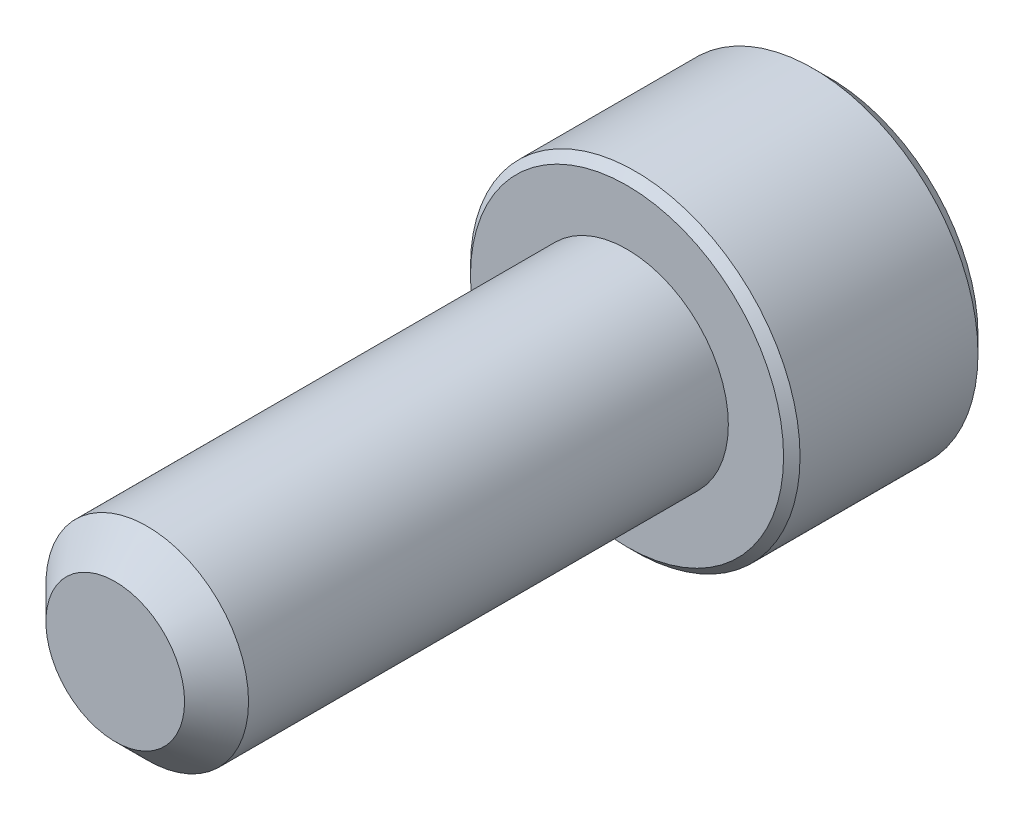
ISO-10303-21;
HEADER;
FILE_DESCRIPTION(('STEP AP214'),'2;1');
FILE_NAME('part.step','',(''),(''),'','','');
FILE_SCHEMA(('AUTOMOTIVE_DESIGN { 1 0 10303 214 1 1 1 1 }'));
ENDSEC;
DATA;
#1=APPLICATION_CONTEXT('core data for automotive mechanical design processes');
#2=APPLICATION_PROTOCOL_DEFINITION('international standard','automotive_design',2000,#1);
#3=PRODUCT_CONTEXT('',#1,'mechanical');
#4=PRODUCT('Part','Part','',(#3));
#5=PRODUCT_RELATED_PRODUCT_CATEGORY('part','',(#4));
#6=PRODUCT_DEFINITION_FORMATION('','',#4);
#7=PRODUCT_DEFINITION_CONTEXT('part definition',#1,'design');
#8=PRODUCT_DEFINITION('design','',#6,#7);
#9=PRODUCT_DEFINITION_SHAPE('','',#8);
#10=(LENGTH_UNIT() NAMED_UNIT(*) SI_UNIT(.MILLI.,.METRE.));
#11=(NAMED_UNIT(*) PLANE_ANGLE_UNIT() SI_UNIT($,.RADIAN.));
#12=(NAMED_UNIT(*) SI_UNIT($,.STERADIAN.) SOLID_ANGLE_UNIT());
#13=UNCERTAINTY_MEASURE_WITH_UNIT(LENGTH_MEASURE(1.E-05),#10,'distance_accuracy_value','');
#14=(GEOMETRIC_REPRESENTATION_CONTEXT(3) GLOBAL_UNCERTAINTY_ASSIGNED_CONTEXT((#13)) GLOBAL_UNIT_ASSIGNED_CONTEXT((#10,
#11,#12)) REPRESENTATION_CONTEXT('',''));
#15=CARTESIAN_POINT('',(0.,0.,0.));
#16=DIRECTION('',(0.,0.,1.));
#17=DIRECTION('',(1.,0.,0.));
#18=AXIS2_PLACEMENT_3D('',#15,#16,#17);
#19=CARTESIAN_POINT('',(0.,0.,-6.35));
#20=DIRECTION('',(0.,0.,1.));
#21=DIRECTION('',(1.,0.,0.));
#22=AXIS2_PLACEMENT_3D('',#19,#20,#21);
#23=CYLINDRICAL_SURFACE('',#22,1.2573);
#24=CARTESIAN_POINT('',(0.,0.,-0.396875));
#25=DIRECTION('',(0.,0.,1.));
#26=DIRECTION('',(1.,0.,0.));
#27=AXIS2_PLACEMENT_3D('',#24,#25,#26);
#28=CIRCLE('',#27,1.2573);
#29=CARTESIAN_POINT('',(1.2573,0.,-0.396875));
#30=VERTEX_POINT('',#29);
#31=EDGE_CURVE('E111',#30,#30,#28,.F.);
#32=ORIENTED_EDGE('',*,*,#31,.T.);
#33=EDGE_LOOP('',(#32));
#34=FACE_BOUND('',#33,.T.);
#35=CARTESIAN_POINT('',(0.,0.,-6.35));
#36=DIRECTION('',(0.,0.,-1.));
#37=DIRECTION('',(-1.,0.,0.));
#38=AXIS2_PLACEMENT_3D('',#35,#36,#37);
#39=CIRCLE('',#38,1.2573);
#40=CARTESIAN_POINT('',(-1.2573,0.,-6.35));
#41=VERTEX_POINT('',#40);
#42=EDGE_CURVE('E214',#41,#41,#39,.F.);
#43=ORIENTED_EDGE('',*,*,#42,.T.);
#44=EDGE_LOOP('',(#43));
#45=FACE_BOUND('',#44,.T.);
#46=ADVANCED_FACE('F37',(#34,#45),#23,.T.);
#47=CARTESIAN_POINT('',(0.,0.,0.));
#48=DIRECTION('',(0.,0.,1.));
#49=DIRECTION('',(1.,0.,0.));
#50=AXIS2_PLACEMENT_3D('',#47,#48,#49);
#51=PLANE('',#50);
#52=CARTESIAN_POINT('',(0.,0.,0.));
#53=DIRECTION('',(0.,0.,1.));
#54=DIRECTION('',(1.,0.,0.));
#55=AXIS2_PLACEMENT_3D('',#52,#53,#54);
#56=CIRCLE('',#55,0.860425000000002);
#57=CARTESIAN_POINT('',(0.860425000000002,0.,0.));
#58=VERTEX_POINT('',#57);
#59=EDGE_CURVE('E213',#58,#58,#56,.T.);
#60=ORIENTED_EDGE('',*,*,#59,.T.);
#61=EDGE_LOOP('',(#60));
#62=FACE_BOUND('',#61,.T.);
#63=ADVANCED_FACE('F191',(#62),#51,.T.);
#64=CARTESIAN_POINT('',(0.,0.,0.));
#65=DIRECTION('',(0.,0.,-1.));
#66=DIRECTION('',(-1.,0.,0.));
#67=AXIS2_PLACEMENT_3D('',#64,#65,#66);
#68=CONICAL_SURFACE('',#67,0.860425000000002,0.785398163397446);
#69=ORIENTED_EDGE('',*,*,#31,.F.);
#70=EDGE_LOOP('',(#69));
#71=FACE_BOUND('',#70,.T.);
#72=ORIENTED_EDGE('',*,*,#59,.F.);
#73=EDGE_LOOP('',(#72));
#74=FACE_BOUND('',#73,.T.);
#75=ADVANCED_FACE('F197',(#71,#74),#68,.T.);
#76=CARTESIAN_POINT('',(0.,0.,-8.8646));
#77=DIRECTION('',(0.,0.,1.));
#78=DIRECTION('',(1.,0.,0.));
#79=AXIS2_PLACEMENT_3D('',#76,#77,#78);
#80=CYLINDRICAL_SURFACE('',#79,2.0447);
#81=CARTESIAN_POINT('',(0.,0.,-6.452235));
#82=DIRECTION('',(0.,0.,-1.));
#83=DIRECTION('',(-1.,0.,0.));
#84=AXIS2_PLACEMENT_3D('',#81,#82,#83);
#85=CIRCLE('',#84,2.0447);
#86=CARTESIAN_POINT('',(-2.0447,0.,-6.452235));
#87=VERTEX_POINT('',#86);
#88=EDGE_CURVE('E45',#87,#87,#85,.T.);
#89=ORIENTED_EDGE('',*,*,#88,.T.);
#90=EDGE_LOOP('',(#89));
#91=FACE_BOUND('',#90,.T.);
#92=CARTESIAN_POINT('',(0.,0.,-8.66013));
#93=DIRECTION('',(0.,0.,-1.));
#94=DIRECTION('',(-1.,0.,0.));
#95=AXIS2_PLACEMENT_3D('',#92,#93,#94);
#96=CIRCLE('',#95,2.0447);
#97=CARTESIAN_POINT('',(-2.0447,0.,-8.66013));
#98=VERTEX_POINT('',#97);
#99=EDGE_CURVE('E174',#98,#98,#96,.F.);
#100=ORIENTED_EDGE('',*,*,#99,.T.);
#101=EDGE_LOOP('',(#100));
#102=FACE_BOUND('',#101,.T.);
#103=ADVANCED_FACE('F179',(#91,#102),#80,.T.);
#104=CARTESIAN_POINT('',(0.,0.,-8.8646));
#105=DIRECTION('',(0.,0.,-1.));
#106=DIRECTION('',(-1.,0.,0.));
#107=AXIS2_PLACEMENT_3D('',#104,#105,#106);
#108=PLANE('',#107);
#109=CARTESIAN_POINT('',(0.,0.,-8.8646));
#110=DIRECTION('',(0.,0.,-1.));
#111=DIRECTION('',(-1.,0.,0.));
#112=AXIS2_PLACEMENT_3D('',#109,#110,#111);
#113=CIRCLE('',#112,1.84023);
#114=CARTESIAN_POINT('',(-1.84023,0.,-8.8646));
#115=VERTEX_POINT('',#114);
#116=EDGE_CURVE('E110',#115,#115,#113,.T.);
#117=ORIENTED_EDGE('',*,*,#116,.T.);
#118=EDGE_LOOP('',(#117));
#119=FACE_BOUND('',#118,.T.);
#120=CARTESIAN_POINT('',(0.,0.,-8.8646));
#121=DIRECTION('',(0.,0.,-1.));
#122=DIRECTION('',(-1.,0.,0.));
#123=AXIS2_PLACEMENT_3D('',#120,#121,#122);
#124=CIRCLE('',#123,1.14567944042316);
#125=CARTESIAN_POINT('',(-0.9921875,0.572839720211583,-8.8646));
#126=VERTEX_POINT('',#125);
#127=CARTESIAN_POINT('',(0.,1.14567944042316,-8.8646));
#128=VERTEX_POINT('',#127);
#129=EDGE_CURVE('E91',#126,#128,#124,.T.);
#130=ORIENTED_EDGE('',*,*,#129,.F.);
#131=CARTESIAN_POINT('',(-0.9921875,-0.572839720211582,-8.8646));
#132=VERTEX_POINT('',#131);
#133=EDGE_CURVE('E51',#132,#126,#124,.T.);
#134=ORIENTED_EDGE('',*,*,#133,.F.);
#135=CARTESIAN_POINT('',(0.,-1.14567944042316,-8.8646));
#136=VERTEX_POINT('',#135);
#137=EDGE_CURVE('E273',#136,#132,#124,.T.);
#138=ORIENTED_EDGE('',*,*,#137,.F.);
#139=CARTESIAN_POINT('',(0.9921875,-0.572839720211582,-8.8646));
#140=VERTEX_POINT('',#139);
#141=EDGE_CURVE('E58',#140,#136,#124,.T.);
#142=ORIENTED_EDGE('',*,*,#141,.F.);
#143=CARTESIAN_POINT('',(0.9921875,0.572839720211582,-8.8646));
#144=VERTEX_POINT('',#143);
#145=EDGE_CURVE('E132',#144,#140,#124,.T.);
#146=ORIENTED_EDGE('',*,*,#145,.F.);
#147=EDGE_CURVE('E100',#128,#144,#124,.T.);
#148=ORIENTED_EDGE('',*,*,#147,.F.);
#149=EDGE_LOOP('',(#130,#134,#138,#142,#146,#148));
#150=FACE_BOUND('',#149,.T.);
#151=ADVANCED_FACE('F131',(#119,#150),#108,.T.);
#152=CARTESIAN_POINT('',(0.,0.,-6.35));
#153=DIRECTION('',(0.,0.,-1.));
#154=DIRECTION('',(-1.,0.,0.));
#155=AXIS2_PLACEMENT_3D('',#152,#153,#154);
#156=PLANE('',#155);
#157=CARTESIAN_POINT('',(0.,0.,-6.35));
#158=DIRECTION('',(0.,0.,-1.));
#159=DIRECTION('',(-1.,0.,0.));
#160=AXIS2_PLACEMENT_3D('',#157,#158,#159);
#161=CIRCLE('',#160,1.942465);
#162=CARTESIAN_POINT('',(-1.942465,0.,-6.35));
#163=VERTEX_POINT('',#162);
#164=EDGE_CURVE('E12',#163,#163,#161,.F.);
#165=ORIENTED_EDGE('',*,*,#164,.T.);
#166=EDGE_LOOP('',(#165));
#167=FACE_BOUND('',#166,.T.);
#168=ORIENTED_EDGE('',*,*,#42,.F.);
#169=EDGE_LOOP('',(#168));
#170=FACE_BOUND('',#169,.T.);
#171=ADVANCED_FACE('F285',(#167,#170),#156,.F.);
#172=CARTESIAN_POINT('',(0.,0.,-8.8646));
#173=DIRECTION('',(0.,0.,-1.));
#174=DIRECTION('',(-1.,0.,0.));
#175=AXIS2_PLACEMENT_3D('',#172,#173,#174);
#176=CONICAL_SURFACE('',#175,1.14567944042316,0.78539816339745);
#177=ORIENTED_EDGE('',*,*,#147,.T.);
#178=CARTESIAN_POINT('',(-0.000200000000000158,1.145794910477,-8.86471548750897));
#179=CARTESIAN_POINT('',(0.0339140752321556,1.12609913995856,-8.84503281140466));
#180=CARTESIAN_POINT('',(0.0685985894922791,1.10607402631377,-8.82650568451841));
#181=CARTESIAN_POINT('',(0.139324581199958,1.06524035596264,-8.79258232965041));
#182=CARTESIAN_POINT('',(0.175372791624241,1.04442791197037,-8.77720498723095));
#183=CARTESIAN_POINT('',(0.248062511737395,1.00246048249572,-8.75086314273428));
#184=CARTESIAN_POINT('',(0.2846854890132,0.981316196707012,-8.73983239651314));
#185=CARTESIAN_POINT('',(0.358737506246055,0.938562244623589,-8.72283620567294));
#186=CARTESIAN_POINT('',(0.396164282559342,0.916953885244213,-8.71685806757892));
#187=CARTESIAN_POINT('',(0.46066463860547,0.879714587318154,-8.71146634491429));
#188=CARTESIAN_POINT('',(0.487654299314528,0.864132099442443,-8.71066899638834));
#189=CARTESIAN_POINT('',(0.541581355945663,0.832997298779853,-8.71200819336142));
#190=CARTESIAN_POINT('',(0.568518739024238,0.817444993408173,-8.71414538613705));
#191=CARTESIAN_POINT('',(0.648946222958496,0.771010163908485,-8.72481757130602));
#192=CARTESIAN_POINT('',(0.702036069363281,0.740358726795446,-8.73761438072271));
#193=CARTESIAN_POINT('',(0.795214637965796,0.686562055130081,-8.76849746765013));
#194=CARTESIAN_POINT('',(0.835740306309515,0.663164549602745,-8.7849650089077));
#195=CARTESIAN_POINT('',(0.915204315708207,0.617285982385523,-8.82206038355681));
#196=CARTESIAN_POINT('',(0.954147338261523,0.594802217831308,-8.84267468064554));
#197=CARTESIAN_POINT('',(0.9923875,0.572724250157744,-8.86471548750897));
#198=B_SPLINE_CURVE_WITH_KNOTS('',3,(#178,#179,#180,#181,#182,#183,#184,#185,#186,#187,#188,
#189,#190,#191,#192,#193,#194,#195,#196,#197),.UNSPECIFIED.,.F.,.F.,(4,2,2,2,2,2,2,2,2,4),(0.,
0.13219718521019,0.265165186853262,0.396020097605669,0.526545281028573,0.619935205043264,
0.713345731536163,0.900220051846368,1.04884529769095,1.1969930355767),.UNSPECIFIED.);
#199=EDGE_CURVE('E105',#128,#144,#198,.T.);
#200=ORIENTED_EDGE('',*,*,#199,.F.);
#201=EDGE_LOOP('',(#177,#200));
#202=FACE_BOUND('',#201,.T.);
#203=ADVANCED_FACE('F106',(#202),#176,.F.);
#204=ORIENTED_EDGE('',*,*,#145,.T.);
#205=CARTESIAN_POINT('',(0.9921875,-1.14247621078911,-9.23209203940828));
#206=CARTESIAN_POINT('',(0.9921875,-1.11465764801141,-9.2110916392497));
#207=CARTESIAN_POINT('',(0.9921875,-1.08668408094051,-9.19029714770578));
#208=CARTESIAN_POINT('',(0.9921875,-1.03036405365904,-9.1492050376869));
#209=CARTESIAN_POINT('',(0.9921875,-1.00201750223733,-9.12890754435707));
#210=CARTESIAN_POINT('',(0.9921875,-0.915909012346496,-9.06859850749393));
#211=CARTESIAN_POINT('',(0.9921875,-0.857501195839067,-9.02949385217264));
#212=CARTESIAN_POINT('',(0.9921875,-0.735022281240404,-8.95272675276114));
#213=CARTESIAN_POINT('',(0.9921875,-0.670818221894542,-8.91527403099626));
#214=CARTESIAN_POINT('',(0.9921875,-0.539203244212802,-8.84676502046105));
#215=CARTESIAN_POINT('',(0.9921875,-0.471804118965061,-8.81568716825431));
#216=CARTESIAN_POINT('',(0.9921875,-0.370637445252798,-8.77766629623626));
#217=CARTESIAN_POINT('',(0.9921875,-0.338367677251604,-8.76675403233245));
#218=CARTESIAN_POINT('',(0.9921875,-0.273049086247197,-8.74752023009933));
#219=CARTESIAN_POINT('',(0.9921875,-0.240000209742887,-8.73919887024719));
#220=CARTESIAN_POINT('',(0.9921875,-0.173878395816095,-8.72571877368215));
#221=CARTESIAN_POINT('',(0.9921875,-0.140816774716471,-8.72050539396509));
#222=CARTESIAN_POINT('',(0.9921875,-0.0743291671992153,-8.71333971245706));
#223=CARTESIAN_POINT('',(0.9921875,-0.0409031259919585,-8.71138790803542));
#224=CARTESIAN_POINT('',(0.9921875,0.0247631141129243,-8.71089348590571));
#225=CARTESIAN_POINT('',(0.9921875,0.0570024445003659,-8.71223003142075));
#226=CARTESIAN_POINT('',(0.9921875,0.12119422050107,-8.71797104321384));
#227=CARTESIAN_POINT('',(0.9921875,0.153146730366262,-8.72237480409387));
#228=CARTESIAN_POINT('',(0.9921875,0.217090524657735,-8.73408451115969));
#229=CARTESIAN_POINT('',(0.9921875,0.249072542149664,-8.74144030243665));
#230=CARTESIAN_POINT('',(0.9921875,0.312337779758395,-8.7586630913854));
#231=CARTESIAN_POINT('',(0.9921875,0.343621058108105,-8.76852987893501));
#232=CARTESIAN_POINT('',(0.9921875,0.442112983138562,-8.80330611159688));
#233=CARTESIAN_POINT('',(0.9921875,0.507919771198879,-8.83217616415081));
#234=CARTESIAN_POINT('',(0.9921875,0.636441891183644,-8.89636520992333));
#235=CARTESIAN_POINT('',(0.9921875,0.699145053961293,-8.93170737220965));
#236=CARTESIAN_POINT('',(0.9921875,0.818979830095493,-9.00462137086766));
#237=CARTESIAN_POINT('',(0.9921875,0.876233471712467,-9.04199513504846));
#238=CARTESIAN_POINT('',(0.9921875,0.960585190784996,-9.09977111190454));
#239=CARTESIAN_POINT('',(0.9921875,0.988338378424187,-9.11923348767096));
#240=CARTESIAN_POINT('',(0.9921875,1.04346551341386,-9.15867298177173));
#241=CARTESIAN_POINT('',(0.9921875,1.07083956239906,-9.17864995788478));
#242=CARTESIAN_POINT('',(0.9921875,1.09805574523311,-9.19884030564271));
#243=B_SPLINE_CURVE_WITH_KNOTS('',3,(#205,#206,#207,#208,#209,#210,#211,#212,#213,#214,#215,
#216,#217,#218,#219,#220,#221,#222,#223,#224,#225,#226,#227,#228,#229,#230,#231,#232,#233,#234,
#235,#236,#237,#238,#239,#240,#241,#242),.UNSPECIFIED.,.F.,.F.,(4,2,2,2,2,2,2,2,2,2,2,2,2,2,2,2,
2,2,4),(0.,0.104563127371703,0.209152318679108,0.419927098975113,0.642732653870157,
0.864771652131277,0.966879847039378,1.06899507422301,1.16925752982867,1.26953527342201,
1.36618351686957,1.46280954049584,1.56114078094885,1.65946379566813,1.87441437168727,
2.09015003608822,2.29516517576016,2.39685303378669,2.49851308339968),.UNSPECIFIED.);
#244=EDGE_CURVE('E99',#144,#140,#243,.F.);
#245=ORIENTED_EDGE('',*,*,#244,.F.);
#246=EDGE_LOOP('',(#204,#245));
#247=FACE_BOUND('',#246,.T.);
#248=ADVANCED_FACE('F279',(#247),#176,.F.);
#249=ORIENTED_EDGE('',*,*,#141,.T.);
#250=CARTESIAN_POINT('',(0.9923875,-0.572724250157744,-8.86471548750897));
#251=CARTESIAN_POINT('',(0.958273424767844,-0.592420020676184,-8.84503281140466));
#252=CARTESIAN_POINT('',(0.923588910507721,-0.612445134320978,-8.82650568451841));
#253=CARTESIAN_POINT('',(0.852862918800041,-0.65327880467211,-8.79258232965041));
#254=CARTESIAN_POINT('',(0.816814708375758,-0.674091248664374,-8.77720498723095));
#255=CARTESIAN_POINT('',(0.744124988262605,-0.716058678139022,-8.75086314273428));
#256=CARTESIAN_POINT('',(0.707502010986799,-0.737202963927734,-8.73983239651314));
#257=CARTESIAN_POINT('',(0.633449993753944,-0.779956916011157,-8.72283620567294));
#258=CARTESIAN_POINT('',(0.596023217440658,-0.801565275390533,-8.71685806757892));
#259=CARTESIAN_POINT('',(0.53152286139453,-0.838804573316592,-8.71146634491429));
#260=CARTESIAN_POINT('',(0.504533200685471,-0.854387061192303,-8.71066899638834));
#261=CARTESIAN_POINT('',(0.450606144054336,-0.885521861854893,-8.71200819336142));
#262=CARTESIAN_POINT('',(0.423668760975761,-0.901074167226573,-8.71414538613705));
#263=CARTESIAN_POINT('',(0.343241277041503,-0.947508996726261,-8.72481757130602));
#264=CARTESIAN_POINT('',(0.290151430636718,-0.9781604338393,-8.73761438072271));
#265=CARTESIAN_POINT('',(0.196972862034203,-1.03195710550467,-8.76849746765013));
#266=CARTESIAN_POINT('',(0.156447193690484,-1.055354611032,-8.7849650089077));
#267=CARTESIAN_POINT('',(0.0769831842917936,-1.10123317824922,-8.82206038355681));
#268=CARTESIAN_POINT('',(0.0380401617384773,-1.12371694280344,-8.84267468064554));
#269=CARTESIAN_POINT('',(-0.000199999999999378,-1.145794910477,-8.86471548750897));
#270=B_SPLINE_CURVE_WITH_KNOTS('',3,(#250,#251,#252,#253,#254,#255,#256,#257,#258,#259,#260,
#261,#262,#263,#264,#265,#266,#267,#268,#269),.UNSPECIFIED.,.F.,.F.,(4,2,2,2,2,2,2,2,2,4),(0.,
0.132197185210189,0.265165186853262,0.396020097605669,0.526545281028573,0.619935205043264,
0.713345731536164,0.900220051846369,1.04884529769095,1.19699303557669),.UNSPECIFIED.);
#271=EDGE_CURVE('E142',#140,#136,#270,.T.);
#272=ORIENTED_EDGE('',*,*,#271,.F.);
#273=EDGE_LOOP('',(#249,#272));
#274=FACE_BOUND('',#273,.T.);
#275=ADVANCED_FACE('F276',(#274),#176,.F.);
#276=ORIENTED_EDGE('',*,*,#137,.T.);
#277=CARTESIAN_POINT('',(0.000199999999999847,-1.145794910477,-8.86471548750897));
#278=CARTESIAN_POINT('',(-0.0339140752321565,-1.12609913995856,-8.84503281140465));
#279=CARTESIAN_POINT('',(-0.0685985894922804,-1.10607402631377,-8.82650568451841));
#280=CARTESIAN_POINT('',(-0.13932458119996,-1.06524035596263,-8.7925823296504));
#281=CARTESIAN_POINT('',(-0.175372791624243,-1.04442791197037,-8.77720498723095));
#282=CARTESIAN_POINT('',(-0.248062511737396,-1.00246048249572,-8.75086314273428));
#283=CARTESIAN_POINT('',(-0.284685489013202,-0.981316196707011,-8.73983239651314));
#284=CARTESIAN_POINT('',(-0.358737506246057,-0.938562244623587,-8.72283620567294));
#285=CARTESIAN_POINT('',(-0.396164282559343,-0.916953885244212,-8.71685806757892));
#286=CARTESIAN_POINT('',(-0.460664638605471,-0.879714587318153,-8.71146634491429));
#287=CARTESIAN_POINT('',(-0.48765429931453,-0.864132099442441,-8.71066899638834));
#288=CARTESIAN_POINT('',(-0.541581355945665,-0.832997298779852,-8.71200819336142));
#289=CARTESIAN_POINT('',(-0.56851873902424,-0.817444993408172,-8.71414538613705));
#290=CARTESIAN_POINT('',(-0.648946222958498,-0.771010163908484,-8.72481757130602));
#291=CARTESIAN_POINT('',(-0.702036069363283,-0.740358726795445,-8.73761438072271));
#292=CARTESIAN_POINT('',(-0.795214637965798,-0.68656205513008,-8.76849746765013));
#293=CARTESIAN_POINT('',(-0.835740306309517,-0.663164549602744,-8.7849650089077));
#294=CARTESIAN_POINT('',(-0.915204315708207,-0.617285982385523,-8.82206038355681));
#295=CARTESIAN_POINT('',(-0.954147338261523,-0.594802217831308,-8.84267468064554));
#296=CARTESIAN_POINT('',(-0.9923875,-0.572724250157744,-8.86471548750897));
#297=B_SPLINE_CURVE_WITH_KNOTS('',3,(#277,#278,#279,#280,#281,#282,#283,#284,#285,#286,#287,
#288,#289,#290,#291,#292,#293,#294,#295,#296),.UNSPECIFIED.,.F.,.F.,(4,2,2,2,2,2,2,2,2,4),(0.,
0.132197185210191,0.265165186853263,0.396020097605669,0.526545281028574,0.619935205043265,
0.713345731536164,0.900220051846369,1.04884529769095,1.1969930355767),.UNSPECIFIED.);
#298=EDGE_CURVE('E250',#136,#132,#297,.T.);
#299=ORIENTED_EDGE('',*,*,#298,.F.);
#300=EDGE_LOOP('',(#276,#299));
#301=FACE_BOUND('',#300,.T.);
#302=ADVANCED_FACE('F275',(#301),#176,.F.);
#303=ORIENTED_EDGE('',*,*,#133,.T.);
#304=CARTESIAN_POINT('',(-0.9921875,-1.14247621095534,-9.23209203953379));
#305=CARTESIAN_POINT('',(-0.9921875,-1.11465764817297,-9.21109163937037));
#306=CARTESIAN_POINT('',(-0.9921875,-1.08668408109739,-9.19029714782163));
#307=CARTESIAN_POINT('',(-0.9921875,-1.03036405380652,-9.14920503779312));
#308=CARTESIAN_POINT('',(-0.9921875,-1.00201750238008,-9.12890754445849));
#309=CARTESIAN_POINT('',(-0.9921875,-0.915909012474785,-9.06859850758086));
#310=CARTESIAN_POINT('',(-0.9921875,-0.857501195957519,-9.02949385224995));
#311=CARTESIAN_POINT('',(-0.9921875,-0.735022281337406,-8.95272675281868));
#312=CARTESIAN_POINT('',(-0.9921875,-0.670818221979873,-8.9152740310437));
#313=CARTESIAN_POINT('',(-0.9921875,-0.539203244273796,-8.84676502048978));
#314=CARTESIAN_POINT('',(-0.9921875,-0.471804119013399,-8.81568716827442));
#315=CARTESIAN_POINT('',(-0.9921875,-0.370637445291612,-8.77766629624996));
#316=CARTESIAN_POINT('',(-0.9921875,-0.338367677294406,-8.7667540323464));
#317=CARTESIAN_POINT('',(-0.9921875,-0.273049086298105,-8.74752023011298));
#318=CARTESIAN_POINT('',(-0.9921875,-0.240000209797913,-8.73919887026028));
#319=CARTESIAN_POINT('',(-0.9921875,-0.17387839587922,-8.72571877369319));
#320=CARTESIAN_POINT('',(-0.9921875,-0.140816774783575,-8.72050539397466));
#321=CARTESIAN_POINT('',(-0.9921875,-0.0743291672741469,-8.7133397124628));
#322=CARTESIAN_POINT('',(-0.9921875,-0.0409031260707386,-8.7113879080388));
#323=CARTESIAN_POINT('',(-0.9921875,0.0247631140270446,-8.71089348590368));
#324=CARTESIAN_POINT('',(-0.9921875,0.0570024444112251,-8.71223003141573));
#325=CARTESIAN_POINT('',(-0.9921875,0.121194220405733,-8.71797104320236));
#326=CARTESIAN_POINT('',(-0.9921875,0.15314673026799,-8.72237480407893));
#327=CARTESIAN_POINT('',(-0.9921875,0.21709052455367,-8.73408451113751));
#328=CARTESIAN_POINT('',(-0.9921875,0.249072542042749,-8.74144030241066));
#329=CARTESIAN_POINT('',(-0.9921875,0.312337779646055,-8.75866309135171));
#330=CARTESIAN_POINT('',(-0.9921875,0.343621057993189,-8.76852987889742));
#331=CARTESIAN_POINT('',(-0.992187499999999,0.442112982998623,-8.80330611154092));
#332=CARTESIAN_POINT('',(-0.9921875,0.507919771037745,-8.83217616407796));
#333=CARTESIAN_POINT('',(-0.9921875,0.636441890981749,-8.89636520981482));
#334=CARTESIAN_POINT('',(-0.9921875,0.699145053739842,-8.93170737208238));
#335=CARTESIAN_POINT('',(-0.9921875,0.818979829838882,-9.00462137070446));
#336=CARTESIAN_POINT('',(-0.992187499999999,0.876233471440127,-9.04199513486827));
#337=CARTESIAN_POINT('',(-0.992187499999999,0.960585190489399,-9.09977111169895));
#338=CARTESIAN_POINT('',(-0.992187499999999,0.988338378120948,-9.11923348745696));
#339=CARTESIAN_POINT('',(-0.992187499999999,1.04346551309539,-9.15867298154095));
#340=CARTESIAN_POINT('',(-0.992187499999999,1.07083956207299,-9.17864995764561));
#341=CARTESIAN_POINT('',(-0.992187499999999,1.09805574489947,-9.19884030539516));
#342=B_SPLINE_CURVE_WITH_KNOTS('',3,(#304,#305,#306,#307,#308,#309,#310,#311,#312,#313,#314,
#315,#316,#317,#318,#319,#320,#321,#322,#323,#324,#325,#326,#327,#328,#329,#330,#331,#332,#333,
#334,#335,#336,#337,#338,#339,#340,#341),.UNSPECIFIED.,.F.,.F.,(4,2,2,2,2,2,2,2,2,2,2,2,2,2,2,2,
2,2,4),(0.,0.104563127391606,0.209152318718919,0.419927099055485,0.642732653996012,
0.864771652302187,0.966879847198757,1.06899507437088,1.1692575299655,1.2695352735478,
1.36618351698525,1.4628095406014,1.56114078104352,1.65946379575192,1.87441437169281,
2.090150036015,2.29516517561955,2.39685303361284,2.4985130831926),.UNSPECIFIED.);
#343=EDGE_CURVE('E121',#132,#126,#342,.T.);
#344=ORIENTED_EDGE('',*,*,#343,.F.);
#345=EDGE_LOOP('',(#303,#344));
#346=FACE_BOUND('',#345,.T.);
#347=ADVANCED_FACE('F292',(#346),#176,.F.);
#348=ORIENTED_EDGE('',*,*,#129,.T.);
#349=CARTESIAN_POINT('',(-0.992387499999999,0.572724250157745,-8.86471548750897));
#350=CARTESIAN_POINT('',(-0.958273424767844,0.592420020676185,-8.84503281140465));
#351=CARTESIAN_POINT('',(-0.92358891050772,0.612445134320978,-8.82650568451841));
#352=CARTESIAN_POINT('',(-0.852862918800041,0.65327880467211,-8.79258232965041));
#353=CARTESIAN_POINT('',(-0.816814708375758,0.674091248664374,-8.77720498723095));
#354=CARTESIAN_POINT('',(-0.744124988262605,0.716058678139022,-8.75086314273428));
#355=CARTESIAN_POINT('',(-0.707502010986799,0.737202963927734,-8.73983239651314));
#356=CARTESIAN_POINT('',(-0.633449993753944,0.779956916011157,-8.72283620567294));
#357=CARTESIAN_POINT('',(-0.596023217440658,0.801565275390533,-8.71685806757892));
#358=CARTESIAN_POINT('',(-0.53152286139453,0.838804573316592,-8.71146634491429));
#359=CARTESIAN_POINT('',(-0.504533200685472,0.854387061192303,-8.71066899638834));
#360=CARTESIAN_POINT('',(-0.450606144054337,0.885521861854893,-8.71200819336142));
#361=CARTESIAN_POINT('',(-0.423668760975761,0.901074167226573,-8.71414538613705));
#362=CARTESIAN_POINT('',(-0.343241277041504,0.947508996726261,-8.72481757130602));
#363=CARTESIAN_POINT('',(-0.290151430636718,0.9781604338393,-8.73761438072271));
#364=CARTESIAN_POINT('',(-0.196972862034203,1.03195710550467,-8.76849746765013));
#365=CARTESIAN_POINT('',(-0.156447193690484,1.055354611032,-8.7849650089077));
#366=CARTESIAN_POINT('',(-0.076983184291793,1.10123317824922,-8.82206038355681));
#367=CARTESIAN_POINT('',(-0.0380401617384765,1.12371694280344,-8.84267468064554));
#368=CARTESIAN_POINT('',(0.000200000000000236,1.145794910477,-8.86471548750897));
#369=B_SPLINE_CURVE_WITH_KNOTS('',3,(#349,#350,#351,#352,#353,#354,#355,#356,#357,#358,#359,
#360,#361,#362,#363,#364,#365,#366,#367,#368),.UNSPECIFIED.,.F.,.F.,(4,2,2,2,2,2,2,2,2,4),(0.,
0.132197185210189,0.265165186853261,0.396020097605668,0.526545281028572,0.619935205043262,
0.713345731536162,0.900220051846367,1.04884529769095,1.19699303557669),.UNSPECIFIED.);
#370=EDGE_CURVE('E95',#126,#128,#369,.T.);
#371=ORIENTED_EDGE('',*,*,#370,.F.);
#372=EDGE_LOOP('',(#348,#371));
#373=FACE_BOUND('',#372,.T.);
#374=ADVANCED_FACE('F93',(#373),#176,.F.);
#375=CARTESIAN_POINT('',(0.9921875,1.71851916063475,-7.37631875));
#376=DIRECTION('',(0.,0.,-1.));
#377=DIRECTION('',(-1.,0.,0.));
#378=AXIS2_PLACEMENT_3D('',#375,#376,#377);
#379=PLANE('',#378);
#380=DIRECTION('',(0.866025403784439,0.5,0.));
#381=VECTOR('',#380,1.);
#382=CARTESIAN_POINT('',(-0.9921875,0.572839720211582,-7.37631875));
#383=LINE('',#382,#381);
#384=CARTESIAN_POINT('',(-0.9921875,0.572839720211582,-7.37631875));
#385=VERTEX_POINT('',#384);
#386=CARTESIAN_POINT('',(0.,1.14567944042316,-7.37631875));
#387=VERTEX_POINT('',#386);
#388=EDGE_CURVE('E120',#385,#387,#383,.T.);
#389=ORIENTED_EDGE('',*,*,#388,.T.);
#390=DIRECTION('',(0.866025403784439,-0.5,0.));
#391=VECTOR('',#390,1.);
#392=CARTESIAN_POINT('',(0.,1.14567944042316,-7.37631875));
#393=LINE('',#392,#391);
#394=CARTESIAN_POINT('',(0.9921875,0.572839720211582,-7.37631875));
#395=VERTEX_POINT('',#394);
#396=EDGE_CURVE('E125',#387,#395,#393,.T.);
#397=ORIENTED_EDGE('',*,*,#396,.T.);
#398=DIRECTION('',(0.,-1.,0.));
#399=VECTOR('',#398,1.);
#400=CARTESIAN_POINT('',(0.9921875,0.572839720211582,-7.37631875));
#401=LINE('',#400,#399);
#402=CARTESIAN_POINT('',(0.9921875,-0.572839720211582,-7.37631875));
#403=VERTEX_POINT('',#402);
#404=EDGE_CURVE('E236',#395,#403,#401,.T.);
#405=ORIENTED_EDGE('',*,*,#404,.T.);
#406=DIRECTION('',(-0.866025403784439,-0.5,0.));
#407=VECTOR('',#406,1.);
#408=CARTESIAN_POINT('',(0.9921875,-0.572839720211582,-7.37631875));
#409=LINE('',#408,#407);
#410=CARTESIAN_POINT('',(0.,-1.14567944042316,-7.37631875));
#411=VERTEX_POINT('',#410);
#412=EDGE_CURVE('E233',#403,#411,#409,.T.);
#413=ORIENTED_EDGE('',*,*,#412,.T.);
#414=DIRECTION('',(-0.866025403784439,0.5,0.));
#415=VECTOR('',#414,1.);
#416=CARTESIAN_POINT('',(0.,-1.14567944042316,-7.37631875));
#417=LINE('',#416,#415);
#418=CARTESIAN_POINT('',(-0.9921875,-0.572839720211582,-7.37631875));
#419=VERTEX_POINT('',#418);
#420=EDGE_CURVE('E230',#411,#419,#417,.T.);
#421=ORIENTED_EDGE('',*,*,#420,.T.);
#422=DIRECTION('',(0.,1.,0.));
#423=VECTOR('',#422,1.);
#424=CARTESIAN_POINT('',(-0.9921875,-0.572839720211582,-7.37631875));
#425=LINE('',#424,#423);
#426=EDGE_CURVE('E128',#419,#385,#425,.T.);
#427=ORIENTED_EDGE('',*,*,#426,.T.);
#428=EDGE_LOOP('',(#389,#397,#405,#413,#421,#427));
#429=FACE_BOUND('',#428,.T.);
#430=ADVANCED_FACE('F162',(#429),#379,.T.);
#431=CARTESIAN_POINT('',(0.,1.14567944042316,-7.37631875));
#432=DIRECTION('',(0.5,0.866025403784439,0.));
#433=DIRECTION('',(-0.866025403784439,0.5,0.));
#434=AXIS2_PLACEMENT_3D('',#431,#432,#433);
#435=PLANE('',#434);
#436=DIRECTION('',(0.,0.,-1.));
#437=VECTOR('',#436,1.);
#438=CARTESIAN_POINT('',(0.,1.14567944042316,-7.37631875));
#439=LINE('',#438,#437);
#440=EDGE_CURVE('E117',#387,#128,#439,.T.);
#441=ORIENTED_EDGE('',*,*,#440,.T.);
#442=ORIENTED_EDGE('',*,*,#199,.T.);
#443=DIRECTION('',(0.,0.,-1.));
#444=VECTOR('',#443,1.);
#445=CARTESIAN_POINT('',(0.9921875,0.572839720211582,-7.37631875));
#446=LINE('',#445,#444);
#447=EDGE_CURVE('E127',#395,#144,#446,.T.);
#448=ORIENTED_EDGE('',*,*,#447,.F.);
#449=ORIENTED_EDGE('',*,*,#396,.F.);
#450=EDGE_LOOP('',(#441,#442,#448,#449));
#451=FACE_BOUND('',#450,.T.);
#452=ADVANCED_FACE('F123',(#451),#435,.F.);
#453=CARTESIAN_POINT('',(0.9921875,0.572839720211582,-7.37631875));
#454=DIRECTION('',(1.,0.,0.));
#455=DIRECTION('',(0.,0.,-1.));
#456=AXIS2_PLACEMENT_3D('',#453,#454,#455);
#457=PLANE('',#456);
#458=ORIENTED_EDGE('',*,*,#447,.T.);
#459=ORIENTED_EDGE('',*,*,#244,.T.);
#460=DIRECTION('',(0.,0.,-1.));
#461=VECTOR('',#460,1.);
#462=CARTESIAN_POINT('',(0.9921875,-0.572839720211582,-7.37631875));
#463=LINE('',#462,#461);
#464=EDGE_CURVE('E219',#403,#140,#463,.T.);
#465=ORIENTED_EDGE('',*,*,#464,.F.);
#466=ORIENTED_EDGE('',*,*,#404,.F.);
#467=EDGE_LOOP('',(#458,#459,#465,#466));
#468=FACE_BOUND('',#467,.T.);
#469=ADVANCED_FACE('F151',(#468),#457,.F.);
#470=CARTESIAN_POINT('',(0.9921875,-0.572839720211582,-7.37631875));
#471=DIRECTION('',(0.5,-0.866025403784439,0.));
#472=DIRECTION('',(0.866025403784439,0.5,0.));
#473=AXIS2_PLACEMENT_3D('',#470,#471,#472);
#474=PLANE('',#473);
#475=ORIENTED_EDGE('',*,*,#464,.T.);
#476=ORIENTED_EDGE('',*,*,#271,.T.);
#477=DIRECTION('',(0.,0.,-1.));
#478=VECTOR('',#477,1.);
#479=CARTESIAN_POINT('',(0.,-1.14567944042316,-7.37631875));
#480=LINE('',#479,#478);
#481=EDGE_CURVE('E222',#411,#136,#480,.T.);
#482=ORIENTED_EDGE('',*,*,#481,.F.);
#483=ORIENTED_EDGE('',*,*,#412,.F.);
#484=EDGE_LOOP('',(#475,#476,#482,#483));
#485=FACE_BOUND('',#484,.T.);
#486=ADVANCED_FACE('F155',(#485),#474,.F.);
#487=CARTESIAN_POINT('',(0.,-1.14567944042316,-7.37631875));
#488=DIRECTION('',(-0.5,-0.866025403784439,0.));
#489=DIRECTION('',(0.866025403784439,-0.5,0.));
#490=AXIS2_PLACEMENT_3D('',#487,#488,#489);
#491=PLANE('',#490);
#492=ORIENTED_EDGE('',*,*,#481,.T.);
#493=ORIENTED_EDGE('',*,*,#298,.T.);
#494=DIRECTION('',(0.,0.,-1.));
#495=VECTOR('',#494,1.);
#496=CARTESIAN_POINT('',(-0.9921875,-0.572839720211582,-7.37631875));
#497=LINE('',#496,#495);
#498=EDGE_CURVE('E225',#419,#132,#497,.T.);
#499=ORIENTED_EDGE('',*,*,#498,.F.);
#500=ORIENTED_EDGE('',*,*,#420,.F.);
#501=EDGE_LOOP('',(#492,#493,#499,#500));
#502=FACE_BOUND('',#501,.T.);
#503=ADVANCED_FACE('F258',(#502),#491,.F.);
#504=CARTESIAN_POINT('',(-0.9921875,-0.572839720211582,-7.37631875));
#505=DIRECTION('',(-1.,0.,0.));
#506=DIRECTION('',(0.,-1.,0.));
#507=AXIS2_PLACEMENT_3D('',#504,#505,#506);
#508=PLANE('',#507);
#509=ORIENTED_EDGE('',*,*,#498,.T.);
#510=ORIENTED_EDGE('',*,*,#343,.T.);
#511=DIRECTION('',(0.,0.,-1.));
#512=VECTOR('',#511,1.);
#513=CARTESIAN_POINT('',(-0.9921875,0.572839720211582,-7.37631875));
#514=LINE('',#513,#512);
#515=EDGE_CURVE('E119',#385,#126,#514,.T.);
#516=ORIENTED_EDGE('',*,*,#515,.F.);
#517=ORIENTED_EDGE('',*,*,#426,.F.);
#518=EDGE_LOOP('',(#509,#510,#516,#517));
#519=FACE_BOUND('',#518,.T.);
#520=ADVANCED_FACE('F255',(#519),#508,.F.);
#521=CARTESIAN_POINT('',(-0.9921875,0.572839720211582,-7.37631875));
#522=DIRECTION('',(-0.5,0.866025403784439,0.));
#523=DIRECTION('',(-0.866025403784439,-0.5,0.));
#524=AXIS2_PLACEMENT_3D('',#521,#522,#523);
#525=PLANE('',#524);
#526=ORIENTED_EDGE('',*,*,#515,.T.);
#527=ORIENTED_EDGE('',*,*,#370,.T.);
#528=ORIENTED_EDGE('',*,*,#440,.F.);
#529=ORIENTED_EDGE('',*,*,#388,.F.);
#530=EDGE_LOOP('',(#526,#527,#528,#529));
#531=FACE_BOUND('',#530,.T.);
#532=ADVANCED_FACE('F115',(#531),#525,.F.);
#533=CARTESIAN_POINT('',(0.,0.,-8.8646));
#534=DIRECTION('',(0.,0.,1.));
#535=DIRECTION('',(1.,0.,0.));
#536=AXIS2_PLACEMENT_3D('',#533,#534,#535);
#537=CONICAL_SURFACE('',#536,1.84023,0.785398163397446);
#538=ORIENTED_EDGE('',*,*,#99,.F.);
#539=EDGE_LOOP('',(#538));
#540=FACE_BOUND('',#539,.T.);
#541=ORIENTED_EDGE('',*,*,#116,.F.);
#542=EDGE_LOOP('',(#541));
#543=FACE_BOUND('',#542,.T.);
#544=ADVANCED_FACE('F183',(#540,#543),#537,.T.);
#545=CARTESIAN_POINT('',(0.,0.,-6.452235));
#546=DIRECTION('',(0.,0.,-1.));
#547=DIRECTION('',(-1.,0.,0.));
#548=AXIS2_PLACEMENT_3D('',#545,#546,#547);
#549=CONICAL_SURFACE('',#548,2.0447,0.785398163397448);
#550=ORIENTED_EDGE('',*,*,#164,.F.);
#551=EDGE_LOOP('',(#550));
#552=FACE_BOUND('',#551,.T.);
#553=ORIENTED_EDGE('',*,*,#88,.F.);
#554=EDGE_LOOP('',(#553));
#555=FACE_BOUND('',#554,.T.);
#556=ADVANCED_FACE('F39',(#552,#555),#549,.T.);
#557=CLOSED_SHELL('',(#46,#63,#75,#103,#151,#171,#203,#248,#275,#302,#347,#374,#430,#452,#469,
#486,#503,#520,#532,#544,#556));
#558=MANIFOLD_SOLID_BREP('B2',#557);
#559=ADVANCED_BREP_SHAPE_REPRESENTATION('',(#18,#558),#14);
#560=SHAPE_DEFINITION_REPRESENTATION(#9,#559);
ENDSEC;
END-ISO-10303-21;
